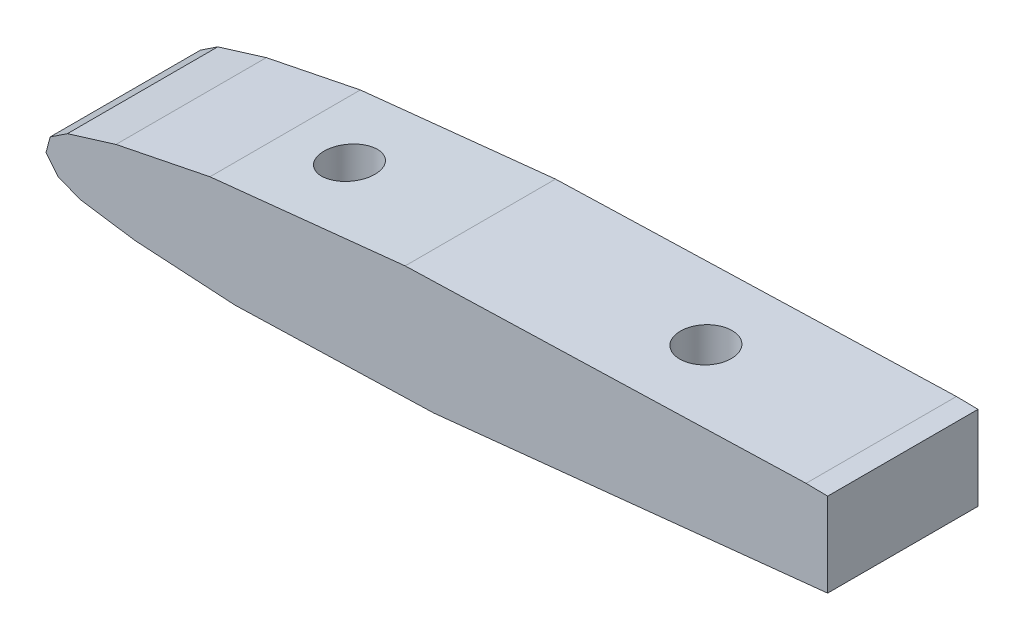
ISO-10303-21;
HEADER;
FILE_DESCRIPTION(('STEP AP214'),'2;1');
FILE_NAME('part.step','',(''),(''),'','','');
FILE_SCHEMA(('AUTOMOTIVE_DESIGN { 1 0 10303 214 1 1 1 1 }'));
ENDSEC;
DATA;
#1=APPLICATION_CONTEXT('core data for automotive mechanical design processes');
#2=APPLICATION_PROTOCOL_DEFINITION('international standard','automotive_design',2000,#1);
#3=PRODUCT_CONTEXT('',#1,'mechanical');
#4=PRODUCT('Part','Part','',(#3));
#5=PRODUCT_RELATED_PRODUCT_CATEGORY('part','',(#4));
#6=PRODUCT_DEFINITION_FORMATION('','',#4);
#7=PRODUCT_DEFINITION_CONTEXT('part definition',#1,'design');
#8=PRODUCT_DEFINITION('design','',#6,#7);
#9=PRODUCT_DEFINITION_SHAPE('','',#8);
#10=(LENGTH_UNIT() NAMED_UNIT(*) SI_UNIT(.MILLI.,.METRE.));
#11=(NAMED_UNIT(*) PLANE_ANGLE_UNIT() SI_UNIT($,.RADIAN.));
#12=(NAMED_UNIT(*) SI_UNIT($,.STERADIAN.) SOLID_ANGLE_UNIT());
#13=UNCERTAINTY_MEASURE_WITH_UNIT(LENGTH_MEASURE(1.E-05),#10,'distance_accuracy_value','');
#14=(GEOMETRIC_REPRESENTATION_CONTEXT(3) GLOBAL_UNCERTAINTY_ASSIGNED_CONTEXT((#13)) GLOBAL_UNIT_ASSIGNED_CONTEXT((#10,
#11,#12)) REPRESENTATION_CONTEXT('',''));
#15=CARTESIAN_POINT('',(0.,0.,0.));
#16=DIRECTION('',(0.,0.,1.));
#17=DIRECTION('',(1.,0.,0.));
#18=AXIS2_PLACEMENT_3D('',#15,#16,#17);
#19=CARTESIAN_POINT('',(81.3102772753721,12.2432322793503,15.));
#20=DIRECTION('',(-0.15220812775618,0.98834846377427,0.));
#21=DIRECTION('',(-0.98834846377427,-0.15220812775618,0.));
#22=AXIS2_PLACEMENT_3D('',#19,#20,#21);
#23=PLANE('',#22);
#24=DIRECTION('',(0.,0.,-1.));
#25=VECTOR('',#24,1.);
#26=CARTESIAN_POINT('',(32.1965677166765,4.67959854783956,15.));
#27=LINE('',#26,#25);
#28=CARTESIAN_POINT('',(32.1965677166765,4.67959854783956,15.));
#29=VERTEX_POINT('',#28);
#30=CARTESIAN_POINT('',(32.1965677166765,4.67959854783956,0.));
#31=VERTEX_POINT('',#30);
#32=EDGE_CURVE('E47',#29,#31,#27,.T.);
#33=ORIENTED_EDGE('',*,*,#32,.F.);
#34=DIRECTION('',(0.988348463774269,0.15220812775618,0.));
#35=VECTOR('',#34,1.);
#36=CARTESIAN_POINT('',(81.3102772753721,12.2432322793503,15.));
#37=LINE('',#36,#35);
#38=CARTESIAN_POINT('',(32.1860935633317,4.67798550210834,15.));
#39=VERTEX_POINT('',#38);
#40=EDGE_CURVE('E260',#39,#29,#37,.T.);
#41=ORIENTED_EDGE('',*,*,#40,.F.);
#42=DIRECTION('',(0.,0.,-1.));
#43=VECTOR('',#42,1.);
#44=CARTESIAN_POINT('',(32.1860935633317,4.67798550210834,15.));
#45=LINE('',#44,#43);
#46=CARTESIAN_POINT('',(32.1860935633317,4.67798550210834,0.));
#47=VERTEX_POINT('',#46);
#48=EDGE_CURVE('E214',#39,#47,#45,.T.);
#49=ORIENTED_EDGE('',*,*,#48,.T.);
#50=DIRECTION('',(0.988348463774269,0.15220812775618,0.));
#51=VECTOR('',#50,1.);
#52=CARTESIAN_POINT('',(81.3102772753721,12.2432322793503,0.));
#53=LINE('',#52,#51);
#54=EDGE_CURVE('E186',#47,#31,#53,.T.);
#55=ORIENTED_EDGE('',*,*,#54,.T.);
#56=EDGE_LOOP('',(#33,#41,#49,#55));
#57=FACE_BOUND('',#56,.T.);
#58=ADVANCED_FACE('F33',(#57),#23,.F.);
#59=CARTESIAN_POINT('',(81.3102772753721,12.2432322793503,15.));
#60=DIRECTION('',(-0.01661859946313,-0.99986190154035,0.));
#61=DIRECTION('',(0.99986190154035,-0.01661859946313,0.));
#62=AXIS2_PLACEMENT_3D('',#59,#60,#61);
#63=PLANE('',#62);
#64=DIRECTION('',(0.,0.,1.));
#65=VECTOR('',#64,1.);
#66=CARTESIAN_POINT('',(32.1965677166765,13.059546078333,15.));
#67=LINE('',#66,#65);
#68=CARTESIAN_POINT('',(32.1965677166765,13.059546078333,0.));
#69=VERTEX_POINT('',#68);
#70=CARTESIAN_POINT('',(32.1965677166765,13.059546078333,15.));
#71=VERTEX_POINT('',#70);
#72=EDGE_CURVE('E244',#69,#71,#67,.T.);
#73=ORIENTED_EDGE('',*,*,#72,.F.);
#74=DIRECTION('',(-0.99986190154035,0.01661859946313,0.));
#75=VECTOR('',#74,1.);
#76=CARTESIAN_POINT('',(81.3102772753721,12.2432322793503,0.));
#77=LINE('',#76,#75);
#78=CARTESIAN_POINT('',(30.0456847114358,13.0952956784538,0.));
#79=VERTEX_POINT('',#78);
#80=EDGE_CURVE('E189',#69,#79,#77,.T.);
#81=ORIENTED_EDGE('',*,*,#80,.T.);
#82=DIRECTION('',(0.,0.,-1.));
#83=VECTOR('',#82,1.);
#84=CARTESIAN_POINT('',(30.0456847114358,13.0952956784538,15.));
#85=LINE('',#84,#83);
#86=CARTESIAN_POINT('',(30.0456847114358,13.0952956784538,15.));
#87=VERTEX_POINT('',#86);
#88=EDGE_CURVE('E211',#87,#79,#85,.T.);
#89=ORIENTED_EDGE('',*,*,#88,.F.);
#90=DIRECTION('',(-0.99986190154035,0.01661859946313,0.));
#91=VECTOR('',#90,1.);
#92=CARTESIAN_POINT('',(81.3102772753721,12.2432322793503,15.));
#93=LINE('',#92,#91);
#94=EDGE_CURVE('E262',#71,#87,#93,.T.);
#95=ORIENTED_EDGE('',*,*,#94,.F.);
#96=EDGE_LOOP('',(#73,#81,#89,#95));
#97=FACE_BOUND('',#96,.T.);
#98=ADVANCED_FACE('F318',(#97),#63,.F.);
#99=CARTESIAN_POINT('',(0.,0.,15.));
#100=DIRECTION('',(0.,0.,1.));
#101=DIRECTION('',(1.,0.,0.));
#102=AXIS2_PLACEMENT_3D('',#99,#100,#101);
#103=PLANE('',#102);
#104=ORIENTED_EDGE('',*,*,#40,.T.);
#105=DIRECTION('',(0.,1.,0.));
#106=VECTOR('',#105,1.);
#107=CARTESIAN_POINT('',(32.1965677166765,0.,15.));
#108=LINE('',#107,#106);
#109=EDGE_CURVE('E235',#29,#71,#108,.T.);
#110=ORIENTED_EDGE('',*,*,#109,.T.);
#111=ORIENTED_EDGE('',*,*,#94,.T.);
#112=DIRECTION('',(-0.999537984032698,-0.0303943823074158,0.));
#113=VECTOR('',#112,1.);
#114=CARTESIAN_POINT('',(30.0456847114358,13.0952956784538,15.));
#115=LINE('',#114,#113);
#116=CARTESIAN_POINT('',(-9.95297447297554,11.8789991910206,15.));
#117=VERTEX_POINT('',#116);
#118=EDGE_CURVE('E264',#87,#117,#115,.T.);
#119=ORIENTED_EDGE('',*,*,#118,.T.);
#120=DIRECTION('',(-0.994582242538382,-0.103952695142181,0.));
#121=VECTOR('',#120,1.);
#122=CARTESIAN_POINT('',(-9.95297447297554,11.8789991910206,15.));
#123=LINE('',#122,#121);
#124=CARTESIAN_POINT('',(-29.4219502592156,9.84412221647076,15.));
#125=VERTEX_POINT('',#124);
#126=EDGE_CURVE('E266',#117,#125,#123,.T.);
#127=ORIENTED_EDGE('',*,*,#126,.T.);
#128=DIRECTION('',(-0.98021463265634,-0.197937550571882,0.));
#129=VECTOR('',#128,1.);
#130=CARTESIAN_POINT('',(-29.4219502592156,9.84412221647076,15.));
#131=LINE('',#130,#129);
#132=CARTESIAN_POINT('',(-38.7976032858901,7.95086972534781,15.));
#133=VERTEX_POINT('',#132);
#134=EDGE_CURVE('E151',#125,#133,#131,.T.);
#135=ORIENTED_EDGE('',*,*,#134,.T.);
#136=DIRECTION('',(-0.955586792825607,-0.294709825722302,0.));
#137=VECTOR('',#136,1.);
#138=CARTESIAN_POINT('',(-38.7976032858901,7.95086972534781,15.));
#139=LINE('',#138,#137);
#140=CARTESIAN_POINT('',(-43.6487104252,6.45475346430278,15.));
#141=VERTEX_POINT('',#140);
#142=EDGE_CURVE('E143',#133,#141,#139,.T.);
#143=ORIENTED_EDGE('',*,*,#142,.T.);
#144=DIRECTION('',(-0.833532162449364,-0.552470935129159,0.));
#145=VECTOR('',#144,1.);
#146=CARTESIAN_POINT('',(-43.6487104252,6.45475346430278,15.));
#147=LINE('',#146,#145);
#148=CARTESIAN_POINT('',(-45.3686817430843,5.31474446981534,15.));
#149=VERTEX_POINT('',#148);
#150=EDGE_CURVE('E148',#141,#149,#147,.T.);
#151=ORIENTED_EDGE('',*,*,#150,.T.);
#152=DIRECTION('',(-0.254320118718322,-0.967120094515205,0.));
#153=VECTOR('',#152,1.);
#154=CARTESIAN_POINT('',(-45.3686817430843,5.31474446981534,15.));
#155=LINE('',#154,#153);
#156=CARTESIAN_POINT('',(-45.7816399631383,3.74436067626318,15.));
#157=VERTEX_POINT('',#156);
#158=EDGE_CURVE('E56',#149,#157,#155,.T.);
#159=ORIENTED_EDGE('',*,*,#158,.T.);
#160=DIRECTION('',(0.629089607829783,-0.777332789299776,0.));
#161=VECTOR('',#160,1.);
#162=CARTESIAN_POINT('',(-44.5971900624202,2.28079851651406,15.));
#163=LINE('',#162,#161);
#164=CARTESIAN_POINT('',(-44.5971900624202,2.28079851651406,15.));
#165=VERTEX_POINT('',#164);
#166=EDGE_CURVE('E201',#157,#165,#163,.T.);
#167=ORIENTED_EDGE('',*,*,#166,.T.);
#168=DIRECTION('',(0.930945965545043,-0.365156965201825,0.));
#169=VECTOR('',#168,1.);
#170=CARTESIAN_POINT('',(-42.3646517073716,1.40510114996612,15.));
#171=LINE('',#170,#169);
#172=CARTESIAN_POINT('',(-42.3646517073716,1.40510114996612,15.));
#173=VERTEX_POINT('',#172);
#174=EDGE_CURVE('E113',#165,#173,#171,.T.);
#175=ORIENTED_EDGE('',*,*,#174,.T.);
#176=DIRECTION('',(0.989133719868268,-0.147018652624634,0.));
#177=VECTOR('',#176,1.);
#178=CARTESIAN_POINT('',(-36.9276061013723,0.596972680380476,15.));
#179=LINE('',#178,#177);
#180=CARTESIAN_POINT('',(-36.9276061013723,0.596972680380476,15.));
#181=VERTEX_POINT('',#180);
#182=EDGE_CURVE('E252',#173,#181,#179,.T.);
#183=ORIENTED_EDGE('',*,*,#182,.T.);
#184=DIRECTION('',(0.99822601160674,-0.0595384728700703,0.));
#185=VECTOR('',#184,1.);
#186=CARTESIAN_POINT('',(-26.9187222814121,0.,15.));
#187=LINE('',#186,#185);
#188=CARTESIAN_POINT('',(-26.9187222814121,0.,15.));
#189=VERTEX_POINT('',#188);
#190=EDGE_CURVE('E254',#181,#189,#187,.T.);
#191=ORIENTED_EDGE('',*,*,#190,.T.);
#192=DIRECTION('',(0.999552685337245,0.0299070097987467,0.));
#193=VECTOR('',#192,1.);
#194=CARTESIAN_POINT('',(-7.08322164456599,0.593485986893278,15.));
#195=LINE('',#194,#193);
#196=CARTESIAN_POINT('',(-7.08322164456599,0.593485986893278,15.));
#197=VERTEX_POINT('',#196);
#198=EDGE_CURVE('E256',#189,#197,#195,.T.);
#199=ORIENTED_EDGE('',*,*,#198,.T.);
#200=DIRECTION('',(0.994634199071349,0.103454386266104,0.));
#201=VECTOR('',#200,1.);
#202=CARTESIAN_POINT('',(32.1860935633317,4.67798550210834,15.));
#203=LINE('',#202,#201);
#204=EDGE_CURVE('E258',#197,#39,#203,.T.);
#205=ORIENTED_EDGE('',*,*,#204,.T.);
#206=EDGE_LOOP('',(#104,#110,#111,#119,#127,#135,#143,#151,#159,#167,#175,#183,#191,#199,#205));
#207=FACE_BOUND('',#206,.T.);
#208=ADVANCED_FACE('F146',(#207),#103,.T.);
#209=CARTESIAN_POINT('',(0.,0.,0.));
#210=DIRECTION('',(0.,0.,1.));
#211=DIRECTION('',(1.,0.,0.));
#212=AXIS2_PLACEMENT_3D('',#209,#210,#211);
#213=PLANE('',#212);
#214=DIRECTION('',(0.,1.,0.));
#215=VECTOR('',#214,1.);
#216=CARTESIAN_POINT('',(32.1965677166765,0.,0.));
#217=LINE('',#216,#215);
#218=EDGE_CURVE('E11',#31,#69,#217,.T.);
#219=ORIENTED_EDGE('',*,*,#218,.F.);
#220=ORIENTED_EDGE('',*,*,#54,.F.);
#221=DIRECTION('',(0.994634199071349,0.103454386266104,0.));
#222=VECTOR('',#221,1.);
#223=CARTESIAN_POINT('',(32.1860935633317,4.67798550210834,0.));
#224=LINE('',#223,#222);
#225=CARTESIAN_POINT('',(-7.08322164456599,0.593485986893278,0.));
#226=VERTEX_POINT('',#225);
#227=EDGE_CURVE('E184',#226,#47,#224,.T.);
#228=ORIENTED_EDGE('',*,*,#227,.F.);
#229=DIRECTION('',(0.999552685337245,0.0299070097987467,0.));
#230=VECTOR('',#229,1.);
#231=CARTESIAN_POINT('',(-7.08322164456599,0.593485986893278,0.));
#232=LINE('',#231,#230);
#233=CARTESIAN_POINT('',(-26.9187222814121,0.,0.));
#234=VERTEX_POINT('',#233);
#235=EDGE_CURVE('E182',#234,#226,#232,.T.);
#236=ORIENTED_EDGE('',*,*,#235,.F.);
#237=DIRECTION('',(0.99822601160674,-0.0595384728700703,0.));
#238=VECTOR('',#237,1.);
#239=CARTESIAN_POINT('',(-26.9187222814121,0.,0.));
#240=LINE('',#239,#238);
#241=CARTESIAN_POINT('',(-36.9276061013723,0.596972680380476,0.));
#242=VERTEX_POINT('',#241);
#243=EDGE_CURVE('E180',#242,#234,#240,.T.);
#244=ORIENTED_EDGE('',*,*,#243,.F.);
#245=DIRECTION('',(0.989133719868268,-0.147018652624634,0.));
#246=VECTOR('',#245,1.);
#247=CARTESIAN_POINT('',(-36.9276061013723,0.596972680380476,0.));
#248=LINE('',#247,#246);
#249=CARTESIAN_POINT('',(-42.3646517073716,1.40510114996612,0.));
#250=VERTEX_POINT('',#249);
#251=EDGE_CURVE('E178',#250,#242,#248,.T.);
#252=ORIENTED_EDGE('',*,*,#251,.F.);
#253=DIRECTION('',(0.930945965545043,-0.365156965201825,0.));
#254=VECTOR('',#253,1.);
#255=CARTESIAN_POINT('',(-42.3646517073716,1.40510114996612,0.));
#256=LINE('',#255,#254);
#257=CARTESIAN_POINT('',(-44.5971900624202,2.28079851651406,0.));
#258=VERTEX_POINT('',#257);
#259=EDGE_CURVE('E175',#258,#250,#256,.T.);
#260=ORIENTED_EDGE('',*,*,#259,.F.);
#261=DIRECTION('',(0.629089607829783,-0.777332789299776,0.));
#262=VECTOR('',#261,1.);
#263=CARTESIAN_POINT('',(-44.5971900624202,2.28079851651406,0.));
#264=LINE('',#263,#262);
#265=CARTESIAN_POINT('',(-45.7816399631383,3.74436067626318,0.));
#266=VERTEX_POINT('',#265);
#267=EDGE_CURVE('E172',#266,#258,#264,.T.);
#268=ORIENTED_EDGE('',*,*,#267,.F.);
#269=DIRECTION('',(-0.254320118718322,-0.967120094515205,0.));
#270=VECTOR('',#269,1.);
#271=CARTESIAN_POINT('',(-45.3686817430843,5.31474446981534,0.));
#272=LINE('',#271,#270);
#273=CARTESIAN_POINT('',(-45.3686817430843,5.31474446981534,0.));
#274=VERTEX_POINT('',#273);
#275=EDGE_CURVE('E104',#274,#266,#272,.T.);
#276=ORIENTED_EDGE('',*,*,#275,.F.);
#277=DIRECTION('',(-0.833532162449364,-0.552470935129159,0.));
#278=VECTOR('',#277,1.);
#279=CARTESIAN_POINT('',(-43.6487104252,6.45475346430278,0.));
#280=LINE('',#279,#278);
#281=CARTESIAN_POINT('',(-43.6487104252,6.45475346430278,0.));
#282=VERTEX_POINT('',#281);
#283=EDGE_CURVE('E198',#282,#274,#280,.T.);
#284=ORIENTED_EDGE('',*,*,#283,.F.);
#285=DIRECTION('',(-0.955586792825607,-0.294709825722302,0.));
#286=VECTOR('',#285,1.);
#287=CARTESIAN_POINT('',(-38.7976032858901,7.95086972534781,0.));
#288=LINE('',#287,#286);
#289=CARTESIAN_POINT('',(-38.7976032858901,7.95086972534781,0.));
#290=VERTEX_POINT('',#289);
#291=EDGE_CURVE('E160',#290,#282,#288,.T.);
#292=ORIENTED_EDGE('',*,*,#291,.F.);
#293=DIRECTION('',(-0.98021463265634,-0.197937550571882,0.));
#294=VECTOR('',#293,1.);
#295=CARTESIAN_POINT('',(-29.4219502592156,9.84412221647076,0.));
#296=LINE('',#295,#294);
#297=CARTESIAN_POINT('',(-29.4219502592156,9.84412221647076,0.));
#298=VERTEX_POINT('',#297);
#299=EDGE_CURVE('E195',#298,#290,#296,.T.);
#300=ORIENTED_EDGE('',*,*,#299,.F.);
#301=DIRECTION('',(-0.994582242538382,-0.103952695142181,0.));
#302=VECTOR('',#301,1.);
#303=CARTESIAN_POINT('',(-9.95297447297554,11.8789991910206,0.));
#304=LINE('',#303,#302);
#305=CARTESIAN_POINT('',(-9.95297447297554,11.8789991910206,0.));
#306=VERTEX_POINT('',#305);
#307=EDGE_CURVE('E193',#306,#298,#304,.T.);
#308=ORIENTED_EDGE('',*,*,#307,.F.);
#309=DIRECTION('',(-0.999537984032698,-0.0303943823074158,0.));
#310=VECTOR('',#309,1.);
#311=CARTESIAN_POINT('',(30.0456847114358,13.0952956784538,0.));
#312=LINE('',#311,#310);
#313=EDGE_CURVE('E191',#79,#306,#312,.T.);
#314=ORIENTED_EDGE('',*,*,#313,.F.);
#315=ORIENTED_EDGE('',*,*,#80,.F.);
#316=EDGE_LOOP('',(#219,#220,#228,#236,#244,#252,#260,#268,#276,#284,#292,#300,#308,#314,#315));
#317=FACE_BOUND('',#316,.T.);
#318=ADVANCED_FACE('F279',(#317),#213,.F.);
#319=CARTESIAN_POINT('',(32.1860935633317,4.67798550210834,15.));
#320=DIRECTION('',(-0.103454386266104,0.994634199071349,0.));
#321=DIRECTION('',(-0.994634199071349,-0.103454386266104,0.));
#322=AXIS2_PLACEMENT_3D('',#319,#320,#321);
#323=PLANE('',#322);
#324=ORIENTED_EDGE('',*,*,#227,.T.);
#325=ORIENTED_EDGE('',*,*,#48,.F.);
#326=ORIENTED_EDGE('',*,*,#204,.F.);
#327=DIRECTION('',(0.,0.,-1.));
#328=VECTOR('',#327,1.);
#329=CARTESIAN_POINT('',(-7.08322164456599,0.593485986893278,15.));
#330=LINE('',#329,#328);
#331=EDGE_CURVE('E217',#197,#226,#330,.T.);
#332=ORIENTED_EDGE('',*,*,#331,.T.);
#333=EDGE_LOOP('',(#324,#325,#326,#332));
#334=FACE_BOUND('',#333,.T.);
#335=CARTESIAN_POINT('',(12.5528099375798,2.63587865540338,7.5));
#336=DIRECTION('',(-0.103454386266104,0.994634199071349,0.));
#337=DIRECTION('',(-0.994634199071349,-0.103454386266104,0.));
#338=AXIS2_PLACEMENT_3D('',#335,#336,#337);
#339=ELLIPSE('',#338,2.55370266010509,2.54);
#340=CARTESIAN_POINT('',(10.0128099375798,2.37168691399609,7.5));
#341=VERTEX_POINT('',#340);
#342=EDGE_CURVE('E232',#341,#341,#339,.F.);
#343=ORIENTED_EDGE('',*,*,#342,.F.);
#344=EDGE_LOOP('',(#343));
#345=FACE_BOUND('',#344,.T.);
#346=ADVANCED_FACE('F306',(#334,#345),#323,.F.);
#347=CARTESIAN_POINT('',(30.0456847114358,13.0952956784538,15.));
#348=DIRECTION('',(0.0303943823074158,-0.999537984032698,0.));
#349=DIRECTION('',(0.999537984032698,0.0303943823074158,0.));
#350=AXIS2_PLACEMENT_3D('',#347,#348,#349);
#351=PLANE('',#350);
#352=ORIENTED_EDGE('',*,*,#313,.T.);
#353=DIRECTION('',(0.,0.,-1.));
#354=VECTOR('',#353,1.);
#355=CARTESIAN_POINT('',(-9.95297447297554,11.8789991910206,15.));
#356=LINE('',#355,#354);
#357=EDGE_CURVE('E208',#117,#306,#356,.T.);
#358=ORIENTED_EDGE('',*,*,#357,.F.);
#359=ORIENTED_EDGE('',*,*,#118,.F.);
#360=ORIENTED_EDGE('',*,*,#88,.T.);
#361=EDGE_LOOP('',(#352,#358,#359,#360));
#362=FACE_BOUND('',#361,.T.);
#363=CARTESIAN_POINT('',(12.5528099375798,12.5633647943595,7.5));
#364=DIRECTION('',(0.0303943823074158,-0.999537984032698,0.));
#365=DIRECTION('',(-0.999537984032698,-0.0303943823074158,0.));
#366=AXIS2_PLACEMENT_3D('',#363,#364,#365);
#367=ELLIPSE('',#366,2.5411740629928,2.54);
#368=CARTESIAN_POINT('',(10.0128099375798,12.4861273783792,7.5));
#369=VERTEX_POINT('',#368);
#370=EDGE_CURVE('E233',#369,#369,#367,.F.);
#371=ORIENTED_EDGE('',*,*,#370,.F.);
#372=EDGE_LOOP('',(#371));
#373=FACE_BOUND('',#372,.T.);
#374=ADVANCED_FACE('F322',(#362,#373),#351,.F.);
#375=CARTESIAN_POINT('',(-7.08322164456599,0.593485986893278,15.));
#376=DIRECTION('',(-0.0299070097987467,0.999552685337245,0.));
#377=DIRECTION('',(-0.999552685337245,-0.0299070097987467,0.));
#378=AXIS2_PLACEMENT_3D('',#375,#376,#377);
#379=PLANE('',#378);
#380=ORIENTED_EDGE('',*,*,#235,.T.);
#381=ORIENTED_EDGE('',*,*,#331,.F.);
#382=ORIENTED_EDGE('',*,*,#198,.F.);
#383=DIRECTION('',(0.,0.,-1.));
#384=VECTOR('',#383,1.);
#385=CARTESIAN_POINT('',(-26.9187222814121,0.,15.));
#386=LINE('',#385,#384);
#387=EDGE_CURVE('E220',#189,#234,#386,.T.);
#388=ORIENTED_EDGE('',*,*,#387,.T.);
#389=EDGE_LOOP('',(#380,#381,#382,#388));
#390=FACE_BOUND('',#389,.T.);
#391=CARTESIAN_POINT('',(-23.0071900624202,0.117034583686839,7.5));
#392=DIRECTION('',(-0.0299070097987467,0.999552685337245,0.));
#393=DIRECTION('',(-0.999552685337245,-0.0299070097987467,0.));
#394=AXIS2_PLACEMENT_3D('',#391,#392,#393);
#395=ELLIPSE('',#394,2.54113668770048,2.54);
#396=CARTESIAN_POINT('',(-25.5471900624202,0.0410367838678259,7.5));
#397=VERTEX_POINT('',#396);
#398=EDGE_CURVE('E176',#397,#397,#395,.F.);
#399=ORIENTED_EDGE('',*,*,#398,.F.);
#400=EDGE_LOOP('',(#399));
#401=FACE_BOUND('',#400,.T.);
#402=ADVANCED_FACE('F301',(#390,#401),#379,.F.);
#403=CARTESIAN_POINT('',(-9.95297447297554,11.8789991910206,15.));
#404=DIRECTION('',(0.103952695142181,-0.994582242538382,0.));
#405=DIRECTION('',(0.994582242538382,0.103952695142181,0.));
#406=AXIS2_PLACEMENT_3D('',#403,#404,#405);
#407=PLANE('',#406);
#408=ORIENTED_EDGE('',*,*,#307,.T.);
#409=DIRECTION('',(0.,0.,-1.));
#410=VECTOR('',#409,1.);
#411=CARTESIAN_POINT('',(-29.4219502592156,9.84412221647076,15.));
#412=LINE('',#411,#410);
#413=EDGE_CURVE('E205',#125,#298,#412,.T.);
#414=ORIENTED_EDGE('',*,*,#413,.F.);
#415=ORIENTED_EDGE('',*,*,#126,.F.);
#416=ORIENTED_EDGE('',*,*,#357,.T.);
#417=EDGE_LOOP('',(#408,#414,#415,#416));
#418=FACE_BOUND('',#417,.T.);
#419=CARTESIAN_POINT('',(-23.0071900624202,10.5145862390797,7.5));
#420=DIRECTION('',(0.103952695142181,-0.994582242538382,0.));
#421=DIRECTION('',(-0.994582242538382,-0.103952695142181,0.));
#422=AXIS2_PLACEMENT_3D('',#419,#420,#421);
#423=ELLIPSE('',#422,2.55383606439362,2.54);
#424=CARTESIAN_POINT('',(-25.5471900624202,10.2491080972347,7.5));
#425=VERTEX_POINT('',#424);
#426=EDGE_CURVE('E230',#425,#425,#423,.F.);
#427=ORIENTED_EDGE('',*,*,#426,.F.);
#428=EDGE_LOOP('',(#427));
#429=FACE_BOUND('',#428,.T.);
#430=ADVANCED_FACE('F272',(#418,#429),#407,.F.);
#431=CARTESIAN_POINT('',(-44.5971900624202,2.28079851651406,15.));
#432=DIRECTION('',(0.777332789299776,0.629089607829783,0.));
#433=DIRECTION('',(-0.629089607829783,0.777332789299776,0.));
#434=AXIS2_PLACEMENT_3D('',#431,#432,#433);
#435=PLANE('',#434);
#436=ORIENTED_EDGE('',*,*,#267,.T.);
#437=DIRECTION('',(0.,0.,-1.));
#438=VECTOR('',#437,1.);
#439=CARTESIAN_POINT('',(-44.5971900624202,2.28079851651406,15.));
#440=LINE('',#439,#438);
#441=EDGE_CURVE('E41',#165,#258,#440,.T.);
#442=ORIENTED_EDGE('',*,*,#441,.F.);
#443=ORIENTED_EDGE('',*,*,#166,.F.);
#444=DIRECTION('',(0.,0.,-1.));
#445=VECTOR('',#444,1.);
#446=CARTESIAN_POINT('',(-45.7816399631383,3.74436067626318,15.));
#447=LINE('',#446,#445);
#448=EDGE_CURVE('E168',#157,#266,#447,.T.);
#449=ORIENTED_EDGE('',*,*,#448,.T.);
#450=EDGE_LOOP('',(#436,#442,#443,#449));
#451=FACE_BOUND('',#450,.T.);
#452=ADVANCED_FACE('F35',(#451),#435,.F.);
#453=CARTESIAN_POINT('',(-42.3646517073716,1.40510114996612,15.));
#454=DIRECTION('',(0.365156965201825,0.930945965545043,0.));
#455=DIRECTION('',(-0.930945965545043,0.365156965201825,0.));
#456=AXIS2_PLACEMENT_3D('',#453,#454,#455);
#457=PLANE('',#456);
#458=ORIENTED_EDGE('',*,*,#259,.T.);
#459=DIRECTION('',(0.,0.,-1.));
#460=VECTOR('',#459,1.);
#461=CARTESIAN_POINT('',(-42.3646517073716,1.40510114996612,15.));
#462=LINE('',#461,#460);
#463=EDGE_CURVE('E226',#173,#250,#462,.T.);
#464=ORIENTED_EDGE('',*,*,#463,.F.);
#465=ORIENTED_EDGE('',*,*,#174,.F.);
#466=ORIENTED_EDGE('',*,*,#441,.T.);
#467=EDGE_LOOP('',(#458,#464,#465,#466));
#468=FACE_BOUND('',#467,.T.);
#469=ADVANCED_FACE('F287',(#468),#457,.F.);
#470=CARTESIAN_POINT('',(-36.9276061013723,0.596972680380476,15.));
#471=DIRECTION('',(0.147018652624634,0.989133719868268,0.));
#472=DIRECTION('',(-0.989133719868268,0.147018652624634,0.));
#473=AXIS2_PLACEMENT_3D('',#470,#471,#472);
#474=PLANE('',#473);
#475=ORIENTED_EDGE('',*,*,#251,.T.);
#476=DIRECTION('',(0.,0.,-1.));
#477=VECTOR('',#476,1.);
#478=CARTESIAN_POINT('',(-36.9276061013723,0.596972680380476,15.));
#479=LINE('',#478,#477);
#480=EDGE_CURVE('E223',#181,#242,#479,.T.);
#481=ORIENTED_EDGE('',*,*,#480,.F.);
#482=ORIENTED_EDGE('',*,*,#182,.F.);
#483=ORIENTED_EDGE('',*,*,#463,.T.);
#484=EDGE_LOOP('',(#475,#481,#482,#483));
#485=FACE_BOUND('',#484,.T.);
#486=ADVANCED_FACE('F290',(#485),#474,.F.);
#487=CARTESIAN_POINT('',(-26.9187222814121,0.,15.));
#488=DIRECTION('',(0.0595384728700703,0.99822601160674,0.));
#489=DIRECTION('',(-0.99822601160674,0.0595384728700703,0.));
#490=AXIS2_PLACEMENT_3D('',#487,#488,#489);
#491=PLANE('',#490);
#492=ORIENTED_EDGE('',*,*,#243,.T.);
#493=ORIENTED_EDGE('',*,*,#387,.F.);
#494=ORIENTED_EDGE('',*,*,#190,.F.);
#495=ORIENTED_EDGE('',*,*,#480,.T.);
#496=EDGE_LOOP('',(#492,#493,#494,#495));
#497=FACE_BOUND('',#496,.T.);
#498=ADVANCED_FACE('F295',(#497),#491,.F.);
#499=CARTESIAN_POINT('',(-29.4219502592156,9.84412221647076,15.));
#500=DIRECTION('',(0.197937550571882,-0.98021463265634,0.));
#501=DIRECTION('',(0.98021463265634,0.197937550571882,0.));
#502=AXIS2_PLACEMENT_3D('',#499,#500,#501);
#503=PLANE('',#502);
#504=ORIENTED_EDGE('',*,*,#299,.T.);
#505=DIRECTION('',(0.,0.,-1.));
#506=VECTOR('',#505,1.);
#507=CARTESIAN_POINT('',(-38.7976032858901,7.95086972534781,15.));
#508=LINE('',#507,#506);
#509=EDGE_CURVE('E163',#133,#290,#508,.T.);
#510=ORIENTED_EDGE('',*,*,#509,.F.);
#511=ORIENTED_EDGE('',*,*,#134,.F.);
#512=ORIENTED_EDGE('',*,*,#413,.T.);
#513=EDGE_LOOP('',(#504,#510,#511,#512));
#514=FACE_BOUND('',#513,.T.);
#515=ADVANCED_FACE('F277',(#514),#503,.F.);
#516=CARTESIAN_POINT('',(-38.7976032858901,7.95086972534781,15.));
#517=DIRECTION('',(0.294709825722302,-0.955586792825607,0.));
#518=DIRECTION('',(0.955586792825607,0.294709825722302,0.));
#519=AXIS2_PLACEMENT_3D('',#516,#517,#518);
#520=PLANE('',#519);
#521=ORIENTED_EDGE('',*,*,#291,.T.);
#522=DIRECTION('',(0.,0.,-1.));
#523=VECTOR('',#522,1.);
#524=CARTESIAN_POINT('',(-43.6487104252,6.45475346430278,15.));
#525=LINE('',#524,#523);
#526=EDGE_CURVE('E157',#141,#282,#525,.T.);
#527=ORIENTED_EDGE('',*,*,#526,.F.);
#528=ORIENTED_EDGE('',*,*,#142,.F.);
#529=ORIENTED_EDGE('',*,*,#509,.T.);
#530=EDGE_LOOP('',(#521,#527,#528,#529));
#531=FACE_BOUND('',#530,.T.);
#532=ADVANCED_FACE('F158',(#531),#520,.F.);
#533=CARTESIAN_POINT('',(-43.6487104252,6.45475346430278,15.));
#534=DIRECTION('',(0.552470935129158,-0.833532162449364,0.));
#535=DIRECTION('',(0.833532162449364,0.552470935129159,0.));
#536=AXIS2_PLACEMENT_3D('',#533,#534,#535);
#537=PLANE('',#536);
#538=ORIENTED_EDGE('',*,*,#283,.T.);
#539=DIRECTION('',(0.,0.,-1.));
#540=VECTOR('',#539,1.);
#541=CARTESIAN_POINT('',(-45.3686817430843,5.31474446981534,15.));
#542=LINE('',#541,#540);
#543=EDGE_CURVE('E164',#149,#274,#542,.T.);
#544=ORIENTED_EDGE('',*,*,#543,.F.);
#545=ORIENTED_EDGE('',*,*,#150,.F.);
#546=ORIENTED_EDGE('',*,*,#526,.T.);
#547=EDGE_LOOP('',(#538,#544,#545,#546));
#548=FACE_BOUND('',#547,.T.);
#549=ADVANCED_FACE('F166',(#548),#537,.F.);
#550=CARTESIAN_POINT('',(-45.3686817430843,5.31474446981534,15.));
#551=DIRECTION('',(0.967120094515205,-0.254320118718322,0.));
#552=DIRECTION('',(0.254320118718322,0.967120094515205,0.));
#553=AXIS2_PLACEMENT_3D('',#550,#551,#552);
#554=PLANE('',#553);
#555=ORIENTED_EDGE('',*,*,#275,.T.);
#556=ORIENTED_EDGE('',*,*,#448,.F.);
#557=ORIENTED_EDGE('',*,*,#158,.F.);
#558=ORIENTED_EDGE('',*,*,#543,.T.);
#559=EDGE_LOOP('',(#555,#556,#557,#558));
#560=FACE_BOUND('',#559,.T.);
#561=ADVANCED_FACE('F281',(#560),#554,.F.);
#562=CARTESIAN_POINT('',(-23.0071900624202,12.7,7.5));
#563=DIRECTION('',(0.,-1.,0.));
#564=DIRECTION('',(0.,0.,-1.));
#565=AXIS2_PLACEMENT_3D('',#562,#563,#564);
#566=CYLINDRICAL_SURFACE('',#565,2.54);
#567=ORIENTED_EDGE('',*,*,#426,.T.);
#568=EDGE_LOOP('',(#567));
#569=FACE_BOUND('',#568,.T.);
#570=ORIENTED_EDGE('',*,*,#398,.T.);
#571=EDGE_LOOP('',(#570));
#572=FACE_BOUND('',#571,.T.);
#573=ADVANCED_FACE('F361',(#569,#572),#566,.F.);
#574=CARTESIAN_POINT('',(12.5528099375798,15.24,7.5));
#575=DIRECTION('',(0.,-1.,0.));
#576=DIRECTION('',(0.,0.,-1.));
#577=AXIS2_PLACEMENT_3D('',#574,#575,#576);
#578=CYLINDRICAL_SURFACE('',#577,2.54);
#579=ORIENTED_EDGE('',*,*,#370,.T.);
#580=EDGE_LOOP('',(#579));
#581=FACE_BOUND('',#580,.T.);
#582=ORIENTED_EDGE('',*,*,#342,.T.);
#583=EDGE_LOOP('',(#582));
#584=FACE_BOUND('',#583,.T.);
#585=ADVANCED_FACE('F368',(#581,#584),#578,.F.);
#586=CARTESIAN_POINT('',(32.1965677166765,15.24,15.5120525635121));
#587=DIRECTION('',(1.,0.,0.));
#588=DIRECTION('',(0.,0.,-1.));
#589=AXIS2_PLACEMENT_3D('',#586,#587,#588);
#590=PLANE('',#589);
#591=ORIENTED_EDGE('',*,*,#32,.T.);
#592=ORIENTED_EDGE('',*,*,#218,.T.);
#593=ORIENTED_EDGE('',*,*,#72,.T.);
#594=ORIENTED_EDGE('',*,*,#109,.F.);
#595=EDGE_LOOP('',(#591,#592,#593,#594));
#596=FACE_BOUND('',#595,.T.);
#597=ADVANCED_FACE('F315',(#596),#590,.T.);
#598=CLOSED_SHELL('',(#58,#98,#208,#318,#346,#374,#402,#430,#452,#469,#486,#498,#515,#532,#549,
#561,#573,#585,#597));
#599=MANIFOLD_SOLID_BREP('B2',#598);
#600=ADVANCED_BREP_SHAPE_REPRESENTATION('',(#18,#599),#14);
#601=SHAPE_DEFINITION_REPRESENTATION(#9,#600);
ENDSEC;
END-ISO-10303-21;
